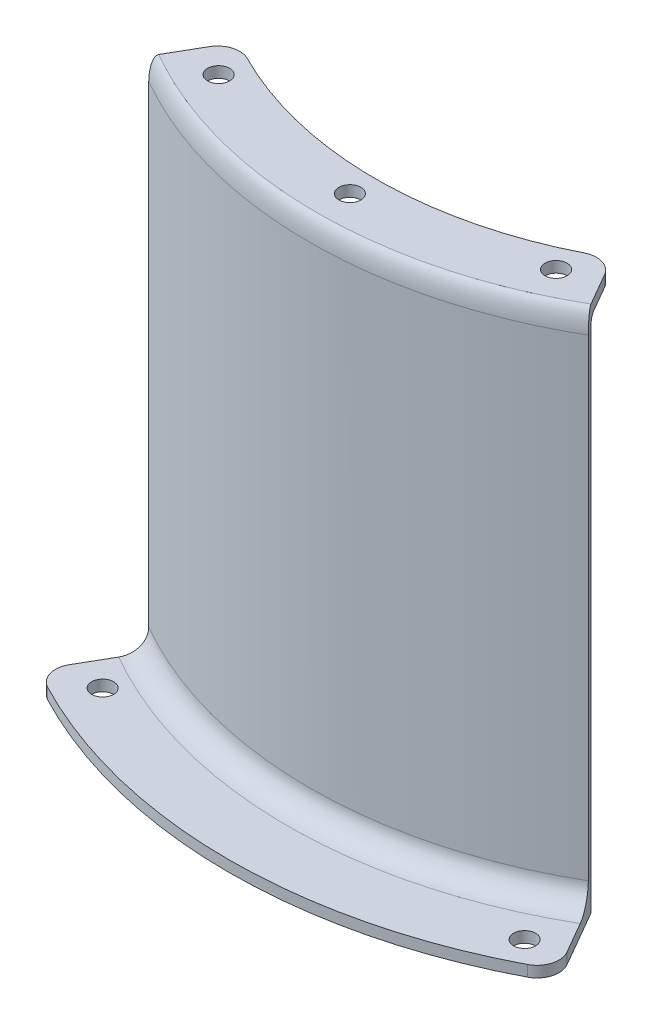
ISO-10303-21;
HEADER;
FILE_DESCRIPTION(('STEP AP214'),'2;1');
FILE_NAME('part.step','',(''),(''),'','','');
FILE_SCHEMA(('AUTOMOTIVE_DESIGN { 1 0 10303 214 1 1 1 1 }'));
ENDSEC;
DATA;
#1=APPLICATION_CONTEXT('core data for automotive mechanical design processes');
#2=APPLICATION_PROTOCOL_DEFINITION('international standard','automotive_design',2000,#1);
#3=PRODUCT_CONTEXT('',#1,'mechanical');
#4=PRODUCT('Part','Part','',(#3));
#5=PRODUCT_RELATED_PRODUCT_CATEGORY('part','',(#4));
#6=PRODUCT_DEFINITION_FORMATION('','',#4);
#7=PRODUCT_DEFINITION_CONTEXT('part definition',#1,'design');
#8=PRODUCT_DEFINITION('design','',#6,#7);
#9=PRODUCT_DEFINITION_SHAPE('','',#8);
#10=(LENGTH_UNIT() NAMED_UNIT(*) SI_UNIT(.MILLI.,.METRE.));
#11=(NAMED_UNIT(*) PLANE_ANGLE_UNIT() SI_UNIT($,.RADIAN.));
#12=(NAMED_UNIT(*) SI_UNIT($,.STERADIAN.) SOLID_ANGLE_UNIT());
#13=UNCERTAINTY_MEASURE_WITH_UNIT(LENGTH_MEASURE(1.E-05),#10,'distance_accuracy_value','');
#14=(GEOMETRIC_REPRESENTATION_CONTEXT(3) GLOBAL_UNCERTAINTY_ASSIGNED_CONTEXT((#13)) GLOBAL_UNIT_ASSIGNED_CONTEXT((#10,
#11,#12)) REPRESENTATION_CONTEXT('',''));
#15=CARTESIAN_POINT('',(0.,0.,0.));
#16=DIRECTION('',(0.,0.,1.));
#17=DIRECTION('',(1.,0.,0.));
#18=AXIS2_PLACEMENT_3D('',#15,#16,#17);
#19=CARTESIAN_POINT('',(23.0326952648682,-0.001000000000001,-9.6062256065026));
#20=DIRECTION('',(0.,1.,0.));
#21=DIRECTION('',(0.4226182617407,0.,0.90630778703665));
#22=AXIS2_PLACEMENT_3D('',#19,#20,#21);
#23=CYLINDRICAL_SURFACE('',#22,1.5);
#24=CARTESIAN_POINT('',(23.0326952648682,70.5,-9.6062256065026));
#25=DIRECTION('',(0.,-1.,0.));
#26=DIRECTION('',(-0.4226182617407,0.,-0.90630778703665));
#27=AXIS2_PLACEMENT_3D('',#24,#25,#26);
#28=CIRCLE('',#27,1.5);
#29=CARTESIAN_POINT('',(22.3987678722571,70.5,-10.9656872870576));
#30=VERTEX_POINT('',#29);
#31=EDGE_CURVE('E388',#30,#30,#28,.F.);
#32=ORIENTED_EDGE('',*,*,#31,.F.);
#33=EDGE_LOOP('',(#32));
#34=FACE_BOUND('',#33,.T.);
#35=CARTESIAN_POINT('',(23.0326952648682,72.,-9.6062256065026));
#36=DIRECTION('',(0.,1.,0.));
#37=DIRECTION('',(0.4226182617407,0.,0.90630778703665));
#38=AXIS2_PLACEMENT_3D('',#35,#36,#37);
#39=CIRCLE('',#38,1.5);
#40=CARTESIAN_POINT('',(23.6666226574792,72.,-8.24676392594762));
#41=VERTEX_POINT('',#40);
#42=EDGE_CURVE('E391',#41,#41,#39,.T.);
#43=ORIENTED_EDGE('',*,*,#42,.T.);
#44=EDGE_LOOP('',(#43));
#45=FACE_BOUND('',#44,.T.);
#46=ADVANCED_FACE('F45',(#34,#45),#23,.F.);
#47=CARTESIAN_POINT('',(-23.0326952648682,-0.001000000000001,-9.6062256065026));
#48=DIRECTION('',(0.,1.,0.));
#49=DIRECTION('',(-0.4226182617407,0.,0.90630778703665));
#50=AXIS2_PLACEMENT_3D('',#47,#48,#49);
#51=CYLINDRICAL_SURFACE('',#50,1.5);
#52=CARTESIAN_POINT('',(-23.0326952648682,70.5,-9.6062256065026));
#53=DIRECTION('',(0.,-1.,0.));
#54=DIRECTION('',(0.4226182617407,0.,-0.90630778703665));
#55=AXIS2_PLACEMENT_3D('',#52,#53,#54);
#56=CIRCLE('',#55,1.5);
#57=CARTESIAN_POINT('',(-22.3987678722571,70.5,-10.9656872870576));
#58=VERTEX_POINT('',#57);
#59=EDGE_CURVE('E170',#58,#58,#56,.F.);
#60=ORIENTED_EDGE('',*,*,#59,.F.);
#61=EDGE_LOOP('',(#60));
#62=FACE_BOUND('',#61,.T.);
#63=CARTESIAN_POINT('',(-23.0326952648682,72.,-9.6062256065026));
#64=DIRECTION('',(0.,1.,0.));
#65=DIRECTION('',(-0.4226182617407,0.,0.90630778703665));
#66=AXIS2_PLACEMENT_3D('',#63,#64,#65);
#67=CIRCLE('',#66,1.5);
#68=CARTESIAN_POINT('',(-23.6666226574792,72.,-8.24676392594762));
#69=VERTEX_POINT('',#68);
#70=EDGE_CURVE('E385',#69,#69,#67,.T.);
#71=ORIENTED_EDGE('',*,*,#70,.T.);
#72=EDGE_LOOP('',(#71));
#73=FACE_BOUND('',#72,.T.);
#74=ADVANCED_FACE('F411',(#62,#73),#51,.F.);
#75=CARTESIAN_POINT('',(0.,75.6,-59.));
#76=DIRECTION('',(0.,1.,0.));
#77=DIRECTION('',(0.,0.,1.));
#78=AXIS2_PLACEMENT_3D('',#75,#76,#77);
#79=CYLINDRICAL_SURFACE('',#78,59.);
#80=DIRECTION('',(0.,1.,0.));
#81=VECTOR('',#80,1.);
#82=CARTESIAN_POINT('',(-29.5000000000001,70.5,-7.90450117671816));
#83=LINE('',#82,#81);
#84=CARTESIAN_POINT('',(-29.5000000000001,0.,-7.90450117671816));
#85=VERTEX_POINT('',#84);
#86=CARTESIAN_POINT('',(-29.5000000000001,69.5,-7.90450117671816));
#87=VERTEX_POINT('',#86);
#88=EDGE_CURVE('E158',#85,#87,#83,.T.);
#89=ORIENTED_EDGE('',*,*,#88,.T.);
#90=CARTESIAN_POINT('',(0.,69.5,-59.));
#91=DIRECTION('',(0.,-1.,0.));
#92=DIRECTION('',(0.,0.,-1.));
#93=AXIS2_PLACEMENT_3D('',#90,#91,#92);
#94=CIRCLE('',#93,59.);
#95=CARTESIAN_POINT('',(29.5000000000001,69.5,-7.90450117671816));
#96=VERTEX_POINT('',#95);
#97=EDGE_CURVE('E176',#87,#96,#94,.F.);
#98=ORIENTED_EDGE('',*,*,#97,.T.);
#99=DIRECTION('',(0.,1.,0.));
#100=VECTOR('',#99,1.);
#101=CARTESIAN_POINT('',(29.5000000000001,70.5,-7.90450117671816));
#102=LINE('',#101,#100);
#103=CARTESIAN_POINT('',(29.5000000000001,0.,-7.90450117671816));
#104=VERTEX_POINT('',#103);
#105=EDGE_CURVE('E154',#104,#96,#102,.T.);
#106=ORIENTED_EDGE('',*,*,#105,.F.);
#107=CARTESIAN_POINT('',(0.,0.,-59.));
#108=DIRECTION('',(0.,1.,0.));
#109=DIRECTION('',(0.,0.,1.));
#110=AXIS2_PLACEMENT_3D('',#107,#108,#109);
#111=CIRCLE('',#110,59.);
#112=EDGE_CURVE('E162',#85,#104,#111,.T.);
#113=ORIENTED_EDGE('',*,*,#112,.F.);
#114=EDGE_LOOP('',(#89,#98,#106,#113));
#115=FACE_BOUND('',#114,.T.);
#116=ADVANCED_FACE('F174',(#115),#79,.F.);
#117=CARTESIAN_POINT('',(-29.5000000000001,0.,-7.90450117671816));
#118=DIRECTION('',(0.,-1.,0.));
#119=DIRECTION('',(0.,0.,-1.));
#120=AXIS2_PLACEMENT_3D('',#117,#118,#119);
#121=PLANE('',#120);
#122=CARTESIAN_POINT('',(-28.9324956880792,0.,0.320407055745003));
#123=DIRECTION('',(0.,-1.,0.));
#124=DIRECTION('',(0.,0.,-1.));
#125=AXIS2_PLACEMENT_3D('',#122,#123,#124);
#126=CIRCLE('',#125,1.5);
#127=CARTESIAN_POINT('',(-28.9324956880792,0.,-1.179592944255));
#128=VERTEX_POINT('',#127);
#129=EDGE_CURVE('E440',#128,#128,#126,.F.);
#130=ORIENTED_EDGE('',*,*,#129,.T.);
#131=EDGE_LOOP('',(#130));
#132=FACE_BOUND('',#131,.T.);
#133=CARTESIAN_POINT('',(29.5939208798571,0.,1.24752451077618));
#134=DIRECTION('',(0.,-1.,0.));
#135=DIRECTION('',(0.,0.,-1.));
#136=AXIS2_PLACEMENT_3D('',#133,#134,#135);
#137=CIRCLE('',#136,1.5);
#138=CARTESIAN_POINT('',(29.5939208798571,0.,-0.252475489223819));
#139=VERTEX_POINT('',#138);
#140=EDGE_CURVE('E445',#139,#139,#137,.F.);
#141=ORIENTED_EDGE('',*,*,#140,.T.);
#142=EDGE_LOOP('',(#141));
#143=FACE_BOUND('',#142,.T.);
#144=CARTESIAN_POINT('',(0.,0.,-59.));
#145=DIRECTION('',(0.,1.,0.));
#146=DIRECTION('',(0.,0.,1.));
#147=AXIS2_PLACEMENT_3D('',#144,#145,#146);
#148=CIRCLE('',#147,71.);
#149=CARTESIAN_POINT('',(-32.7527379417869,0.,3.99411208451655));
#150=VERTEX_POINT('',#149);
#151=CARTESIAN_POINT('',(32.7527379417869,0.,3.99411208451655));
#152=VERTEX_POINT('',#151);
#153=EDGE_CURVE('E171',#150,#152,#148,.T.);
#154=ORIENTED_EDGE('',*,*,#153,.F.);
#155=CARTESIAN_POINT('',(-31.3688194372043,0.,1.33238903869191));
#156=DIRECTION('',(0.,-1.,0.));
#157=DIRECTION('',(0.,0.,-1.));
#158=AXIS2_PLACEMENT_3D('',#155,#156,#157);
#159=CIRCLE('',#158,3.);
#160=CARTESIAN_POINT('',(-33.9668956485576,0.,-0.167610961308088));
#161=VERTEX_POINT('',#160);
#162=EDGE_CURVE('E356',#150,#161,#159,.T.);
#163=ORIENTED_EDGE('',*,*,#162,.T.);
#164=DIRECTION('',(0.500000000000001,0.,-0.866025403784438));
#165=VECTOR('',#164,1.);
#166=CARTESIAN_POINT('',(-29.5000000000001,0.,-7.90450117671816));
#167=LINE('',#166,#165);
#168=EDGE_CURVE('E166',#161,#85,#167,.T.);
#169=ORIENTED_EDGE('',*,*,#168,.T.);
#170=ORIENTED_EDGE('',*,*,#112,.T.);
#171=DIRECTION('',(-0.500000000000001,0.,-0.866025403784438));
#172=VECTOR('',#171,1.);
#173=CARTESIAN_POINT('',(29.5000000000001,0.,-7.90450117671816));
#174=LINE('',#173,#172);
#175=CARTESIAN_POINT('',(33.9668956485576,0.,-0.1676109613081));
#176=VERTEX_POINT('',#175);
#177=EDGE_CURVE('E150',#176,#104,#174,.T.);
#178=ORIENTED_EDGE('',*,*,#177,.F.);
#179=CARTESIAN_POINT('',(31.3688194372043,0.,1.3323890386919));
#180=DIRECTION('',(0.,-1.,0.));
#181=DIRECTION('',(0.,0.,-1.));
#182=AXIS2_PLACEMENT_3D('',#179,#180,#181);
#183=CIRCLE('',#182,3.);
#184=EDGE_CURVE('E354',#176,#152,#183,.T.);
#185=ORIENTED_EDGE('',*,*,#184,.T.);
#186=EDGE_LOOP('',(#154,#163,#169,#170,#178,#185));
#187=FACE_BOUND('',#186,.T.);
#188=ADVANCED_FACE('F164',(#132,#143,#187),#121,.T.);
#189=CARTESIAN_POINT('',(0.,75.6,-59.));
#190=DIRECTION('',(0.,1.,0.));
#191=DIRECTION('',(0.,0.,1.));
#192=AXIS2_PLACEMENT_3D('',#189,#190,#191);
#193=CYLINDRICAL_SURFACE('',#192,71.);
#194=CARTESIAN_POINT('',(0.,1.5,-59.));
#195=DIRECTION('',(0.,1.,0.));
#196=DIRECTION('',(0.,0.,1.));
#197=AXIS2_PLACEMENT_3D('',#194,#195,#196);
#198=CIRCLE('',#197,71.);
#199=CARTESIAN_POINT('',(-32.7527379417869,1.5,3.99411208451655));
#200=VERTEX_POINT('',#199);
#201=CARTESIAN_POINT('',(32.7527379417869,1.5,3.99411208451655));
#202=VERTEX_POINT('',#201);
#203=EDGE_CURVE('E378',#200,#202,#198,.T.);
#204=ORIENTED_EDGE('',*,*,#203,.F.);
#205=DIRECTION('',(0.,1.,0.));
#206=VECTOR('',#205,1.);
#207=CARTESIAN_POINT('',(-32.7527379417869,75.6,3.99411208451657));
#208=LINE('',#207,#206);
#209=EDGE_CURVE('E351',#200,#150,#208,.F.);
#210=ORIENTED_EDGE('',*,*,#209,.T.);
#211=ORIENTED_EDGE('',*,*,#153,.T.);
#212=DIRECTION('',(0.,1.,0.));
#213=VECTOR('',#212,1.);
#214=CARTESIAN_POINT('',(32.7527379417869,75.6,3.99411208451655));
#215=LINE('',#214,#213);
#216=EDGE_CURVE('E349',#152,#202,#215,.T.);
#217=ORIENTED_EDGE('',*,*,#216,.T.);
#218=EDGE_LOOP('',(#204,#210,#211,#217));
#219=FACE_BOUND('',#218,.T.);
#220=ADVANCED_FACE('F457',(#219),#193,.T.);
#221=CARTESIAN_POINT('',(-29.9999999999999,1.5,-7.03847577293393));
#222=DIRECTION('',(0.,1.,0.));
#223=DIRECTION('',(0.,0.,1.));
#224=AXIS2_PLACEMENT_3D('',#221,#222,#223);
#225=PLANE('',#224);
#226=CARTESIAN_POINT('',(-28.9324956880792,1.5,0.320407055745003));
#227=DIRECTION('',(0.,1.,0.));
#228=DIRECTION('',(0.,0.,1.));
#229=AXIS2_PLACEMENT_3D('',#226,#227,#228);
#230=CIRCLE('',#229,1.5);
#231=CARTESIAN_POINT('',(-28.9324956880792,1.5,1.820407055745));
#232=VERTEX_POINT('',#231);
#233=EDGE_CURVE('E438',#232,#232,#230,.T.);
#234=ORIENTED_EDGE('',*,*,#233,.F.);
#235=EDGE_LOOP('',(#234));
#236=FACE_BOUND('',#235,.T.);
#237=CARTESIAN_POINT('',(29.5939208798571,1.5,1.24752451077618));
#238=DIRECTION('',(0.,1.,0.));
#239=DIRECTION('',(0.,0.,1.));
#240=AXIS2_PLACEMENT_3D('',#237,#238,#239);
#241=CIRCLE('',#240,1.5);
#242=CARTESIAN_POINT('',(29.5939208798571,1.5,2.74752451077618));
#243=VERTEX_POINT('',#242);
#244=EDGE_CURVE('E450',#243,#243,#241,.T.);
#245=ORIENTED_EDGE('',*,*,#244,.F.);
#246=EDGE_LOOP('',(#245));
#247=FACE_BOUND('',#246,.T.);
#248=DIRECTION('',(0.500000000000001,0.,0.866025403784438));
#249=VECTOR('',#248,1.);
#250=CARTESIAN_POINT('',(29.9999999999999,1.5,-7.03847577293393));
#251=LINE('',#250,#249);
#252=CARTESIAN_POINT('',(31.5,1.5,-4.44039956158051));
#253=VERTEX_POINT('',#252);
#254=CARTESIAN_POINT('',(33.9668956485576,1.5,-0.167610961308099));
#255=VERTEX_POINT('',#254);
#256=EDGE_CURVE('E159',#253,#255,#251,.T.);
#257=ORIENTED_EDGE('',*,*,#256,.F.);
#258=CARTESIAN_POINT('',(0.,1.5,-59.));
#259=DIRECTION('',(0.,1.,0.));
#260=DIRECTION('',(0.,0.,1.));
#261=AXIS2_PLACEMENT_3D('',#258,#259,#260);
#262=CIRCLE('',#261,62.9999999999999);
#263=CARTESIAN_POINT('',(-31.5,1.5,-4.4403995615805));
#264=VERTEX_POINT('',#263);
#265=EDGE_CURVE('E66',#253,#264,#262,.F.);
#266=ORIENTED_EDGE('',*,*,#265,.T.);
#267=DIRECTION('',(-0.500000000000001,0.,0.866025403784438));
#268=VECTOR('',#267,1.);
#269=CARTESIAN_POINT('',(-29.9999999999999,1.5,-7.03847577293393));
#270=LINE('',#269,#268);
#271=CARTESIAN_POINT('',(-33.9668956485576,1.5,-0.167610961308089));
#272=VERTEX_POINT('',#271);
#273=EDGE_CURVE('E369',#264,#272,#270,.T.);
#274=ORIENTED_EDGE('',*,*,#273,.T.);
#275=CARTESIAN_POINT('',(-31.3688194372043,1.5,1.33238903869191));
#276=DIRECTION('',(0.,1.,0.));
#277=DIRECTION('',(0.,0.,1.));
#278=AXIS2_PLACEMENT_3D('',#275,#276,#277);
#279=CIRCLE('',#278,3.);
#280=EDGE_CURVE('E196',#272,#200,#279,.T.);
#281=ORIENTED_EDGE('',*,*,#280,.T.);
#282=ORIENTED_EDGE('',*,*,#203,.T.);
#283=CARTESIAN_POINT('',(31.3688194372043,1.5,1.3323890386919));
#284=DIRECTION('',(0.,1.,0.));
#285=DIRECTION('',(0.,0.,1.));
#286=AXIS2_PLACEMENT_3D('',#283,#284,#285);
#287=CIRCLE('',#286,3.);
#288=EDGE_CURVE('E462',#202,#255,#287,.T.);
#289=ORIENTED_EDGE('',*,*,#288,.T.);
#290=EDGE_LOOP('',(#257,#266,#274,#281,#282,#289));
#291=FACE_BOUND('',#290,.T.);
#292=ADVANCED_FACE('F455',(#236,#247,#291),#225,.T.);
#293=CARTESIAN_POINT('',(0.,75.6,-59.));
#294=DIRECTION('',(0.,1.,0.));
#295=DIRECTION('',(0.,0.,1.));
#296=AXIS2_PLACEMENT_3D('',#293,#294,#295);
#297=CYLINDRICAL_SURFACE('',#296,59.9999999999999);
#298=DIRECTION('',(0.,-1.,0.));
#299=VECTOR('',#298,1.);
#300=CARTESIAN_POINT('',(-30.0000000000001,72.,-7.03847577293372));
#301=LINE('',#300,#299);
#302=CARTESIAN_POINT('',(-29.9999067155062,69.,-7.03863734641666));
#303=VERTEX_POINT('',#302);
#304=CARTESIAN_POINT('',(-29.9999999999999,4.5,-7.03847577293392));
#305=VERTEX_POINT('',#304);
#306=EDGE_CURVE('E225',#303,#305,#301,.T.);
#307=ORIENTED_EDGE('',*,*,#306,.T.);
#308=CARTESIAN_POINT('',(0.,4.5,-59.));
#309=DIRECTION('',(0.,1.,0.));
#310=DIRECTION('',(0.,0.,1.));
#311=AXIS2_PLACEMENT_3D('',#308,#309,#310);
#312=CIRCLE('',#311,59.9999999999999);
#313=CARTESIAN_POINT('',(29.9999999999999,4.5,-7.03847577293392));
#314=VERTEX_POINT('',#313);
#315=EDGE_CURVE('E215',#305,#314,#312,.T.);
#316=ORIENTED_EDGE('',*,*,#315,.T.);
#317=DIRECTION('',(0.,-1.,0.));
#318=VECTOR('',#317,1.);
#319=CARTESIAN_POINT('',(30.0000000000001,72.,-7.03847577293372));
#320=LINE('',#319,#318);
#321=CARTESIAN_POINT('',(29.9999067454248,69.,-7.03863736368315));
#322=VERTEX_POINT('',#321);
#323=EDGE_CURVE('E195',#322,#314,#320,.T.);
#324=ORIENTED_EDGE('',*,*,#323,.F.);
#325=CARTESIAN_POINT('',(-32.6783421009016,69.,-8.67976592327472));
#326=CARTESIAN_POINT('',(-27.8476934877415,69.,-5.54270603381946));
#327=CARTESIAN_POINT('',(-22.5633259131442,69.,-3.10662686195295));
#328=CARTESIAN_POINT('',(-11.5185154513269,69.,0.164995046135756));
#329=CARTESIAN_POINT('',(-5.75958653134703,69.,0.999999999999885));
#330=CARTESIAN_POINT('',(5.75958653134725,69.,0.999999999999865));
#331=CARTESIAN_POINT('',(11.5185154513446,69.,0.164995046130466));
#332=CARTESIAN_POINT('',(22.5633259131258,69.,-3.10662686194748));
#333=CARTESIAN_POINT('',(27.847693487753,69.,-5.54270603382691));
#334=CARTESIAN_POINT('',(32.6783421009018,69.,-8.67976592327483));
#335=(BOUNDED_CURVE() B_SPLINE_CURVE(3,(#325,#326,#327,#328,#329,#330,#331,#332,#333,#334),
.UNSPECIFIED.,.F.,.F.) B_SPLINE_CURVE_WITH_KNOTS((4,2,2,2,4),(5.70722665402146,5.99520598060052,
6.28318530717959,6.57116463375865,6.85914396033772),
.UNSPECIFIED.) CURVE() GEOMETRIC_REPRESENTATION_ITEM() RATIONAL_B_SPLINE_CURVE((1.,1.,1.,1.,1.,
1.,1.,1.,1.,1.)) REPRESENTATION_ITEM(''));
#336=EDGE_CURVE('E400',#322,#303,#335,.F.);
#337=ORIENTED_EDGE('',*,*,#336,.T.);
#338=EDGE_LOOP('',(#307,#316,#324,#337));
#339=FACE_BOUND('',#338,.T.);
#340=ADVANCED_FACE('F222',(#339),#297,.T.);
#341=CARTESIAN_POINT('',(-25.5,72.,-14.8327044069937));
#342=DIRECTION('',(0.,1.,0.));
#343=DIRECTION('',(0.,0.,1.));
#344=AXIS2_PLACEMENT_3D('',#341,#342,#343);
#345=PLANE('',#344);
#346=ORIENTED_EDGE('',*,*,#42,.F.);
#347=EDGE_LOOP('',(#346));
#348=FACE_BOUND('',#347,.T.);
#349=ORIENTED_EDGE('',*,*,#70,.F.);
#350=EDGE_LOOP('',(#349));
#351=FACE_BOUND('',#350,.T.);
#352=CARTESIAN_POINT('',(0.,72.,-4.5));
#353=DIRECTION('',(0.,1.,0.));
#354=DIRECTION('',(0.,0.,1.));
#355=AXIS2_PLACEMENT_3D('',#352,#353,#354);
#356=CIRCLE('',#355,1.5);
#357=CARTESIAN_POINT('',(0.,72.,-3.));
#358=VERTEX_POINT('',#357);
#359=EDGE_CURVE('E178',#358,#358,#356,.T.);
#360=ORIENTED_EDGE('',*,*,#359,.F.);
#361=EDGE_LOOP('',(#360));
#362=FACE_BOUND('',#361,.T.);
#363=CARTESIAN_POINT('',(0.,72.,-59.));
#364=DIRECTION('',(0.,1.,0.));
#365=DIRECTION('',(0.,0.,1.));
#366=AXIS2_PLACEMENT_3D('',#363,#364,#365);
#367=CIRCLE('',#366,51.);
#368=CARTESIAN_POINT('',(-23.0068790930603,72.,-13.4842498205588));
#369=VERTEX_POINT('',#368);
#370=CARTESIAN_POINT('',(23.0068790930603,72.,-13.4842498205588));
#371=VERTEX_POINT('',#370);
#372=EDGE_CURVE('E375',#369,#371,#367,.T.);
#373=ORIENTED_EDGE('',*,*,#372,.F.);
#374=CARTESIAN_POINT('',(-24.3602249220639,72.,-10.8068527511799));
#375=DIRECTION('',(0.,1.,0.));
#376=DIRECTION('',(0.,0.,1.));
#377=AXIS2_PLACEMENT_3D('',#374,#375,#376);
#378=CIRCLE('',#377,3.);
#379=CARTESIAN_POINT('',(-26.9583011334172,72.,-12.3068527511799));
#380=VERTEX_POINT('',#379);
#381=EDGE_CURVE('E209',#369,#380,#378,.T.);
#382=ORIENTED_EDGE('',*,*,#381,.T.);
#383=DIRECTION('',(-0.500000000000001,0.,0.866025403784438));
#384=VECTOR('',#383,1.);
#385=CARTESIAN_POINT('',(-25.5,72.,-14.8327044069937));
#386=LINE('',#385,#384);
#387=CARTESIAN_POINT('',(-29.4998165404898,72.,-7.90481893791096));
#388=VERTEX_POINT('',#387);
#389=EDGE_CURVE('E359',#380,#388,#386,.T.);
#390=ORIENTED_EDGE('',*,*,#389,.T.);
#391=CARTESIAN_POINT('',(32.1337030658868,72.,-9.51843649122025));
#392=CARTESIAN_POINT('',(27.3835652629588,72.,-6.43366093326307));
#393=CARTESIAN_POINT('',(22.1872704812371,72.,-4.03818308091657));
#394=CARTESIAN_POINT('',(11.3265401938255,72.,-0.82108820463683));
#395=CARTESIAN_POINT('',(5.66359342249146,72.,-1.2490009027033E-13));
#396=CARTESIAN_POINT('',(-5.66359342249125,72.,-1.2490009027033E-13));
#397=CARTESIAN_POINT('',(-11.3265401938061,72.,-0.82108820463692));
#398=CARTESIAN_POINT('',(-22.1872704812571,72.,-4.03818308091666));
#399=CARTESIAN_POINT('',(-27.3835652629309,72.,-6.43366093328321));
#400=CARTESIAN_POINT('',(-32.1337030658866,72.,-9.51843649122015));
#401=(BOUNDED_CURVE() B_SPLINE_CURVE(3,(#391,#392,#393,#394,#395,#396,#397,#398,#399,#400),
.UNSPECIFIED.,.F.,.F.) B_SPLINE_CURVE_WITH_KNOTS((4,2,2,2,4),(5.70722665402146,5.99520598060052,
6.28318530717959,6.57116463375865,6.85914396033772),
.UNSPECIFIED.) CURVE() GEOMETRIC_REPRESENTATION_ITEM() RATIONAL_B_SPLINE_CURVE((1.,1.,1.,1.,1.,
1.,1.,1.,1.,1.)) REPRESENTATION_ITEM(''));
#402=CARTESIAN_POINT('',(29.4998165404952,72.,-7.90481893790173));
#403=VERTEX_POINT('',#402);
#404=EDGE_CURVE('E393',#388,#403,#401,.F.);
#405=ORIENTED_EDGE('',*,*,#404,.T.);
#406=DIRECTION('',(0.500000000000001,0.,0.866025403784438));
#407=VECTOR('',#406,1.);
#408=CARTESIAN_POINT('',(25.5,72.,-14.8327044069937));
#409=LINE('',#408,#407);
#410=CARTESIAN_POINT('',(26.9583011334172,72.,-12.3068527511799));
#411=VERTEX_POINT('',#410);
#412=EDGE_CURVE('E181',#411,#403,#409,.T.);
#413=ORIENTED_EDGE('',*,*,#412,.F.);
#414=CARTESIAN_POINT('',(24.3602249220639,72.,-10.8068527511799));
#415=DIRECTION('',(0.,1.,0.));
#416=DIRECTION('',(0.,0.,1.));
#417=AXIS2_PLACEMENT_3D('',#414,#415,#416);
#418=CIRCLE('',#417,3.);
#419=EDGE_CURVE('E207',#411,#371,#418,.T.);
#420=ORIENTED_EDGE('',*,*,#419,.T.);
#421=EDGE_LOOP('',(#373,#382,#390,#405,#413,#420));
#422=FACE_BOUND('',#421,.T.);
#423=ADVANCED_FACE('F397',(#348,#351,#362,#422),#345,.T.);
#424=CARTESIAN_POINT('',(0.,75.6,-59.));
#425=DIRECTION('',(0.,1.,0.));
#426=DIRECTION('',(0.,0.,1.));
#427=AXIS2_PLACEMENT_3D('',#424,#425,#426);
#428=CYLINDRICAL_SURFACE('',#427,51.);
#429=CARTESIAN_POINT('',(0.,70.5,-59.));
#430=DIRECTION('',(0.,1.,0.));
#431=DIRECTION('',(0.,0.,1.));
#432=AXIS2_PLACEMENT_3D('',#429,#430,#431);
#433=CIRCLE('',#432,51.);
#434=CARTESIAN_POINT('',(-23.0068790930603,70.5,-13.4842498205588));
#435=VERTEX_POINT('',#434);
#436=CARTESIAN_POINT('',(23.0068790930603,70.5,-13.4842498205588));
#437=VERTEX_POINT('',#436);
#438=EDGE_CURVE('E372',#435,#437,#433,.T.);
#439=ORIENTED_EDGE('',*,*,#438,.F.);
#440=DIRECTION('',(0.,1.,0.));
#441=VECTOR('',#440,1.);
#442=CARTESIAN_POINT('',(-23.0068790930603,75.6,-13.4842498205588));
#443=LINE('',#442,#441);
#444=EDGE_CURVE('E204',#435,#369,#443,.T.);
#445=ORIENTED_EDGE('',*,*,#444,.T.);
#446=ORIENTED_EDGE('',*,*,#372,.T.);
#447=DIRECTION('',(0.,1.,0.));
#448=VECTOR('',#447,1.);
#449=CARTESIAN_POINT('',(23.0068790930603,75.6,-13.4842498205588));
#450=LINE('',#449,#448);
#451=EDGE_CURVE('E202',#371,#437,#450,.F.);
#452=ORIENTED_EDGE('',*,*,#451,.T.);
#453=EDGE_LOOP('',(#439,#445,#446,#452));
#454=FACE_BOUND('',#453,.T.);
#455=ADVANCED_FACE('F424',(#454),#428,.F.);
#456=CARTESIAN_POINT('',(-27.2500000000001,70.5,-11.8016154937481));
#457=DIRECTION('',(0.,-1.,0.));
#458=DIRECTION('',(0.,0.,-1.));
#459=AXIS2_PLACEMENT_3D('',#456,#457,#458);
#460=PLANE('',#459);
#461=ORIENTED_EDGE('',*,*,#31,.T.);
#462=EDGE_LOOP('',(#461));
#463=FACE_BOUND('',#462,.T.);
#464=ORIENTED_EDGE('',*,*,#59,.T.);
#465=EDGE_LOOP('',(#464));
#466=FACE_BOUND('',#465,.T.);
#467=CARTESIAN_POINT('',(0.,70.5,-4.5));
#468=DIRECTION('',(0.,-1.,0.));
#469=DIRECTION('',(0.,0.,-1.));
#470=AXIS2_PLACEMENT_3D('',#467,#468,#469);
#471=CIRCLE('',#470,1.5);
#472=CARTESIAN_POINT('',(0.,70.5,-6.));
#473=VERTEX_POINT('',#472);
#474=EDGE_CURVE('E184',#473,#473,#471,.F.);
#475=ORIENTED_EDGE('',*,*,#474,.T.);
#476=EDGE_LOOP('',(#475));
#477=FACE_BOUND('',#476,.T.);
#478=DIRECTION('',(0.500000000000001,0.,-0.866025403784438));
#479=VECTOR('',#478,1.);
#480=CARTESIAN_POINT('',(-27.2500000000001,70.5,-11.8016154937481));
#481=LINE('',#480,#479);
#482=CARTESIAN_POINT('',(-29.0000000000001,70.5,-8.7705265805026));
#483=VERTEX_POINT('',#482);
#484=CARTESIAN_POINT('',(-26.9583011334172,70.5,-12.3068527511799));
#485=VERTEX_POINT('',#484);
#486=EDGE_CURVE('E362',#483,#485,#481,.T.);
#487=ORIENTED_EDGE('',*,*,#486,.T.);
#488=CARTESIAN_POINT('',(-24.3602249220639,70.5,-10.8068527511799));
#489=DIRECTION('',(0.,-1.,0.));
#490=DIRECTION('',(0.,0.,-1.));
#491=AXIS2_PLACEMENT_3D('',#488,#489,#490);
#492=CIRCLE('',#491,3.);
#493=EDGE_CURVE('E213',#485,#435,#492,.T.);
#494=ORIENTED_EDGE('',*,*,#493,.T.);
#495=ORIENTED_EDGE('',*,*,#438,.T.);
#496=CARTESIAN_POINT('',(24.3602249220639,70.5,-10.8068527511799));
#497=DIRECTION('',(0.,-1.,0.));
#498=DIRECTION('',(0.,0.,-1.));
#499=AXIS2_PLACEMENT_3D('',#496,#497,#498);
#500=CIRCLE('',#499,3.);
#501=CARTESIAN_POINT('',(26.9583011334172,70.5,-12.3068527511799));
#502=VERTEX_POINT('',#501);
#503=EDGE_CURVE('E211',#437,#502,#500,.T.);
#504=ORIENTED_EDGE('',*,*,#503,.T.);
#505=DIRECTION('',(-0.500000000000001,0.,-0.866025403784438));
#506=VECTOR('',#505,1.);
#507=CARTESIAN_POINT('',(27.2500000000001,70.5,-11.8016154937481));
#508=LINE('',#507,#506);
#509=CARTESIAN_POINT('',(29.0000000000001,70.5,-8.7705265805026));
#510=VERTEX_POINT('',#509);
#511=EDGE_CURVE('E177',#510,#502,#508,.T.);
#512=ORIENTED_EDGE('',*,*,#511,.F.);
#513=CARTESIAN_POINT('',(0.,70.5,-59.));
#514=DIRECTION('',(0.,-1.,0.));
#515=DIRECTION('',(0.,0.,-1.));
#516=AXIS2_PLACEMENT_3D('',#513,#514,#515);
#517=CIRCLE('',#516,58.);
#518=EDGE_CURVE('E342',#510,#483,#517,.T.);
#519=ORIENTED_EDGE('',*,*,#518,.T.);
#520=EDGE_LOOP('',(#487,#494,#495,#504,#512,#519));
#521=FACE_BOUND('',#520,.T.);
#522=ADVANCED_FACE('F259',(#463,#466,#477,#521),#460,.T.);
#523=CARTESIAN_POINT('',(-29.5000000000001,0.,-7.90450117671816));
#524=DIRECTION('',(-0.866025403784438,0.,-0.500000000000001));
#525=DIRECTION('',(-0.500000000000001,0.,0.866025403784438));
#526=AXIS2_PLACEMENT_3D('',#523,#524,#525);
#527=PLANE('',#526);
#528=ORIENTED_EDGE('',*,*,#168,.F.);
#529=DIRECTION('',(0.,1.,0.));
#530=VECTOR('',#529,1.);
#531=CARTESIAN_POINT('',(-33.9668956485576,0.,-0.167610961308088));
#532=LINE('',#531,#530);
#533=EDGE_CURVE('E466',#161,#272,#532,.T.);
#534=ORIENTED_EDGE('',*,*,#533,.T.);
#535=ORIENTED_EDGE('',*,*,#273,.F.);
#536=CARTESIAN_POINT('',(-31.5,4.5,-4.4403995615805));
#537=DIRECTION('',(-0.866025403784438,0.,-0.500000000000001));
#538=DIRECTION('',(-0.500000000000001,0.,0.866025403784438));
#539=AXIS2_PLACEMENT_3D('',#536,#537,#538);
#540=CIRCLE('',#539,3.);
#541=EDGE_CURVE('E12',#264,#305,#540,.F.);
#542=ORIENTED_EDGE('',*,*,#541,.T.);
#543=ORIENTED_EDGE('',*,*,#306,.F.);
#544=CARTESIAN_POINT('',(-29.4998165404899,72.,-7.90481893791097));
#545=CARTESIAN_POINT('',(-29.9998134310089,72.,-7.03879891990519));
#546=CARTESIAN_POINT('',(-29.9998134310123,69.,-7.0387989198996));
#547=(BOUNDED_CURVE() B_SPLINE_CURVE(2,(#544,#545,#546),.UNSPECIFIED.,.F.,
.F.) B_SPLINE_CURVE_WITH_KNOTS((3,3),(0.,1.),
.UNSPECIFIED.) CURVE() GEOMETRIC_REPRESENTATION_ITEM() RATIONAL_B_SPLINE_CURVE((1.,
0.707106781186548,1.)) REPRESENTATION_ITEM(''));
#548=EDGE_CURVE('E343',#303,#388,#547,.F.);
#549=ORIENTED_EDGE('',*,*,#548,.T.);
#550=ORIENTED_EDGE('',*,*,#389,.F.);
#551=DIRECTION('',(0.,1.,0.));
#552=VECTOR('',#551,1.);
#553=CARTESIAN_POINT('',(-26.9583011334172,0.,-12.3068527511799));
#554=LINE('',#553,#552);
#555=EDGE_CURVE('E358',#380,#485,#554,.F.);
#556=ORIENTED_EDGE('',*,*,#555,.T.);
#557=ORIENTED_EDGE('',*,*,#486,.F.);
#558=CARTESIAN_POINT('',(-29.,69.5,-8.77052658050259));
#559=DIRECTION('',(-0.866025403784438,0.,-0.500000000000001));
#560=DIRECTION('',(-0.500000000000001,0.,0.866025403784438));
#561=AXIS2_PLACEMENT_3D('',#558,#559,#560);
#562=CIRCLE('',#561,1.);
#563=EDGE_CURVE('E347',#483,#87,#562,.F.);
#564=ORIENTED_EDGE('',*,*,#563,.T.);
#565=ORIENTED_EDGE('',*,*,#88,.F.);
#566=EDGE_LOOP('',(#528,#534,#535,#542,#543,#549,#550,#556,#557,#564,#565));
#567=FACE_BOUND('',#566,.T.);
#568=ADVANCED_FACE('F254',(#567),#527,.T.);
#569=CARTESIAN_POINT('',(29.5000000000001,0.,-7.90450117671816));
#570=DIRECTION('',(-0.866025403784438,0.,0.500000000000001));
#571=DIRECTION('',(0.500000000000001,0.,0.866025403784438));
#572=AXIS2_PLACEMENT_3D('',#569,#570,#571);
#573=PLANE('',#572);
#574=ORIENTED_EDGE('',*,*,#323,.T.);
#575=CARTESIAN_POINT('',(31.5,4.5,-4.44039956158051));
#576=DIRECTION('',(-0.866025403784438,0.,0.500000000000001));
#577=DIRECTION('',(0.500000000000001,0.,0.866025403784438));
#578=AXIS2_PLACEMENT_3D('',#575,#576,#577);
#579=CIRCLE('',#578,3.);
#580=EDGE_CURVE('E53',#314,#253,#579,.T.);
#581=ORIENTED_EDGE('',*,*,#580,.T.);
#582=ORIENTED_EDGE('',*,*,#256,.T.);
#583=DIRECTION('',(0.,-1.,0.));
#584=VECTOR('',#583,1.);
#585=CARTESIAN_POINT('',(33.9668956485576,0.,-0.1676109613081));
#586=LINE('',#585,#584);
#587=EDGE_CURVE('E156',#255,#176,#586,.T.);
#588=ORIENTED_EDGE('',*,*,#587,.T.);
#589=ORIENTED_EDGE('',*,*,#177,.T.);
#590=ORIENTED_EDGE('',*,*,#105,.T.);
#591=CARTESIAN_POINT('',(29.0000000000001,69.5,-8.7705265805026));
#592=DIRECTION('',(-0.866025403784438,0.,0.500000000000001));
#593=DIRECTION('',(0.500000000000001,0.,0.866025403784438));
#594=AXIS2_PLACEMENT_3D('',#591,#592,#593);
#595=CIRCLE('',#594,1.);
#596=EDGE_CURVE('E345',#96,#510,#595,.T.);
#597=ORIENTED_EDGE('',*,*,#596,.T.);
#598=ORIENTED_EDGE('',*,*,#511,.T.);
#599=DIRECTION('',(0.,-1.,0.));
#600=VECTOR('',#599,1.);
#601=CARTESIAN_POINT('',(26.9583011334172,72.,-12.3068527511799));
#602=LINE('',#601,#600);
#603=EDGE_CURVE('E198',#502,#411,#602,.F.);
#604=ORIENTED_EDGE('',*,*,#603,.T.);
#605=ORIENTED_EDGE('',*,*,#412,.T.);
#606=CARTESIAN_POINT('',(29.9998134310119,69.,-7.03879891990009));
#607=CARTESIAN_POINT('',(29.999813431008,72.,-7.03879891990589));
#608=CARTESIAN_POINT('',(29.4998165404954,72.,-7.90481893790186));
#609=(BOUNDED_CURVE() B_SPLINE_CURVE(2,(#606,#607,#608),.UNSPECIFIED.,.F.,
.F.) B_SPLINE_CURVE_WITH_KNOTS((3,3),(0.,1.),
.UNSPECIFIED.) CURVE() GEOMETRIC_REPRESENTATION_ITEM() RATIONAL_B_SPLINE_CURVE((1.,
0.707106781186548,1.)) REPRESENTATION_ITEM(''));
#610=EDGE_CURVE('E229',#403,#322,#609,.F.);
#611=ORIENTED_EDGE('',*,*,#610,.T.);
#612=EDGE_LOOP('',(#574,#581,#582,#588,#589,#590,#597,#598,#604,#605,#611));
#613=FACE_BOUND('',#612,.T.);
#614=ADVANCED_FACE('F152',(#613),#573,.F.);
#615=CARTESIAN_POINT('',(0.,-0.001000000000001,-4.5));
#616=DIRECTION('',(0.,1.,0.));
#617=DIRECTION('',(0.,0.,1.));
#618=AXIS2_PLACEMENT_3D('',#615,#616,#617);
#619=CYLINDRICAL_SURFACE('',#618,1.5);
#620=ORIENTED_EDGE('',*,*,#474,.F.);
#621=EDGE_LOOP('',(#620));
#622=FACE_BOUND('',#621,.T.);
#623=ORIENTED_EDGE('',*,*,#359,.T.);
#624=EDGE_LOOP('',(#623));
#625=FACE_BOUND('',#624,.T.);
#626=ADVANCED_FACE('F253',(#622,#625),#619,.F.);
#627=CARTESIAN_POINT('',(29.5939208798571,-0.000999999999999916,1.24752451077618));
#628=DIRECTION('',(0.,1.,0.));
#629=DIRECTION('',(0.,0.,1.));
#630=AXIS2_PLACEMENT_3D('',#627,#628,#629);
#631=CYLINDRICAL_SURFACE('',#630,1.5);
#632=ORIENTED_EDGE('',*,*,#140,.F.);
#633=EDGE_LOOP('',(#632));
#634=FACE_BOUND('',#633,.T.);
#635=ORIENTED_EDGE('',*,*,#244,.T.);
#636=EDGE_LOOP('',(#635));
#637=FACE_BOUND('',#636,.T.);
#638=ADVANCED_FACE('F429',(#634,#637),#631,.F.);
#639=CARTESIAN_POINT('',(-28.9324956880792,-0.000999999999999916,0.320407055745003));
#640=DIRECTION('',(0.,1.,0.));
#641=DIRECTION('',(0.,0.,1.));
#642=AXIS2_PLACEMENT_3D('',#639,#640,#641);
#643=CYLINDRICAL_SURFACE('',#642,1.5);
#644=ORIENTED_EDGE('',*,*,#129,.F.);
#645=EDGE_LOOP('',(#644));
#646=FACE_BOUND('',#645,.T.);
#647=ORIENTED_EDGE('',*,*,#233,.T.);
#648=EDGE_LOOP('',(#647));
#649=FACE_BOUND('',#648,.T.);
#650=ADVANCED_FACE('F298',(#646,#649),#643,.F.);
#651=CARTESIAN_POINT('',(-32.1337030658866,72.,-9.51843649122015));
#652=CARTESIAN_POINT('',(-27.3835652629309,72.,-6.43366093328321));
#653=CARTESIAN_POINT('',(-22.1872704812571,72.,-4.03818308091666));
#654=CARTESIAN_POINT('',(-11.3265401938061,72.,-0.82108820463692));
#655=CARTESIAN_POINT('',(-5.66359342249125,72.,-1.2490009027033E-13));
#656=CARTESIAN_POINT('',(5.66359342249146,72.,-1.2490009027033E-13));
#657=CARTESIAN_POINT('',(11.3265401938255,72.,-0.82108820463683));
#658=CARTESIAN_POINT('',(22.1872704812371,72.,-4.03818308091657));
#659=CARTESIAN_POINT('',(27.3835652629588,72.,-6.43366093326307));
#660=CARTESIAN_POINT('',(32.1337030658868,72.,-9.51843649122025));
#661=CARTESIAN_POINT('',(-32.6783421009016,72.,-8.67976592327472));
#662=CARTESIAN_POINT('',(-27.8476934877319,72.,-5.54270603383559));
#663=CARTESIAN_POINT('',(-22.5633259131453,72.,-3.10662686194935));
#664=CARTESIAN_POINT('',(-11.5185154513258,72.,0.164995046132156));
#665=CARTESIAN_POINT('',(-5.75958653134704,72.,0.999999999999875));
#666=CARTESIAN_POINT('',(5.75958653134725,72.,0.999999999999875));
#667=CARTESIAN_POINT('',(11.5185154513451,72.,0.164995046132247));
#668=CARTESIAN_POINT('',(22.5633259131253,72.,-3.10662686194926));
#669=CARTESIAN_POINT('',(27.8476934877424,72.,-5.5427060338424));
#670=CARTESIAN_POINT('',(32.6783421009018,72.,-8.67976592327483));
#671=CARTESIAN_POINT('',(-32.6783421009016,69.,-8.67976592327472));
#672=CARTESIAN_POINT('',(-27.8476934877415,69.,-5.54270603381946));
#673=CARTESIAN_POINT('',(-22.5633259131442,69.,-3.10662686195295));
#674=CARTESIAN_POINT('',(-11.5185154513269,69.,0.164995046135756));
#675=CARTESIAN_POINT('',(-5.75958653134703,69.,0.999999999999885));
#676=CARTESIAN_POINT('',(5.75958653134725,69.,0.999999999999865));
#677=CARTESIAN_POINT('',(11.5185154513446,69.,0.164995046130466));
#678=CARTESIAN_POINT('',(22.5633259131258,69.,-3.10662686194748));
#679=CARTESIAN_POINT('',(27.847693487753,69.,-5.54270603382691));
#680=CARTESIAN_POINT('',(32.6783421009018,69.,-8.67976592327483));
#681=(BOUNDED_SURFACE() B_SPLINE_SURFACE(2,3,((#651,#652,#653,#654,#655,#656,#657,#658,#659,
#660),(#661,#662,#663,#664,#665,#666,#667,#668,#669,#670),(#671,#672,#673,#674,#675,#676,#677,
#678,#679,#680)),.UNSPECIFIED.,.F.,.F.,.F.) B_SPLINE_SURFACE_WITH_KNOTS((3,3),(4,2,2,2,4),(0.,
1.),(5.70722665402146,5.99520598060052,6.28318530717959,6.57116463375865,6.85914396033772),
.UNSPECIFIED.) GEOMETRIC_REPRESENTATION_ITEM() RATIONAL_B_SPLINE_SURFACE(((1.,1.,1.,1.,1.,1.,1.,
1.,1.,1.),(0.707106781186548,0.707106781186548,0.707106781186548,0.707106781186548,
0.707106781186548,0.707106781186548,0.707106781186548,0.707106781186548,0.707106781186548,
0.707106781186548),(1.,1.,1.,1.,1.,1.,1.,1.,1.,1.))) REPRESENTATION_ITEM('') SURFACE());
#682=ORIENTED_EDGE('',*,*,#548,.F.);
#683=ORIENTED_EDGE('',*,*,#336,.F.);
#684=ORIENTED_EDGE('',*,*,#610,.F.);
#685=ORIENTED_EDGE('',*,*,#404,.F.);
#686=EDGE_LOOP('',(#682,#683,#684,#685));
#687=FACE_BOUND('',#686,.T.);
#688=ADVANCED_FACE('F283',(#687),#681,.T.);
#689=CARTESIAN_POINT('',(0.,69.5,-59.));
#690=DIRECTION('',(0.,-1.,0.));
#691=DIRECTION('',(0.,0.,-1.));
#692=AXIS2_PLACEMENT_3D('',#689,#690,#691);
#693=TOROIDAL_SURFACE('',#692,58.,1.);
#694=ORIENTED_EDGE('',*,*,#563,.F.);
#695=ORIENTED_EDGE('',*,*,#518,.F.);
#696=ORIENTED_EDGE('',*,*,#596,.F.);
#697=ORIENTED_EDGE('',*,*,#97,.F.);
#698=EDGE_LOOP('',(#694,#695,#696,#697));
#699=FACE_BOUND('',#698,.T.);
#700=ADVANCED_FACE('F297',(#699),#693,.F.);
#701=CARTESIAN_POINT('',(-31.3688194372043,75.6,1.33238903869191));
#702=DIRECTION('',(0.,1.,0.));
#703=DIRECTION('',(0.,0.,1.));
#704=AXIS2_PLACEMENT_3D('',#701,#702,#703);
#705=CYLINDRICAL_SURFACE('',#704,3.);
#706=ORIENTED_EDGE('',*,*,#280,.F.);
#707=ORIENTED_EDGE('',*,*,#533,.F.);
#708=ORIENTED_EDGE('',*,*,#162,.F.);
#709=ORIENTED_EDGE('',*,*,#209,.F.);
#710=EDGE_LOOP('',(#706,#707,#708,#709));
#711=FACE_BOUND('',#710,.T.);
#712=ADVANCED_FACE('F472',(#711),#705,.T.);
#713=CARTESIAN_POINT('',(31.3688194372043,75.6,1.3323890386919));
#714=DIRECTION('',(0.,1.,0.));
#715=DIRECTION('',(0.,0.,1.));
#716=AXIS2_PLACEMENT_3D('',#713,#714,#715);
#717=CYLINDRICAL_SURFACE('',#716,3.);
#718=ORIENTED_EDGE('',*,*,#288,.F.);
#719=ORIENTED_EDGE('',*,*,#216,.F.);
#720=ORIENTED_EDGE('',*,*,#184,.F.);
#721=ORIENTED_EDGE('',*,*,#587,.F.);
#722=EDGE_LOOP('',(#718,#719,#720,#721));
#723=FACE_BOUND('',#722,.T.);
#724=ADVANCED_FACE('F467',(#723),#717,.T.);
#725=CARTESIAN_POINT('',(-24.3602249220639,75.6,-10.8068527511799));
#726=DIRECTION('',(0.,1.,0.));
#727=DIRECTION('',(0.,0.,1.));
#728=AXIS2_PLACEMENT_3D('',#725,#726,#727);
#729=CYLINDRICAL_SURFACE('',#728,3.);
#730=ORIENTED_EDGE('',*,*,#493,.F.);
#731=ORIENTED_EDGE('',*,*,#555,.F.);
#732=ORIENTED_EDGE('',*,*,#381,.F.);
#733=ORIENTED_EDGE('',*,*,#444,.F.);
#734=EDGE_LOOP('',(#730,#731,#732,#733));
#735=FACE_BOUND('',#734,.T.);
#736=ADVANCED_FACE('F408',(#735),#729,.T.);
#737=CARTESIAN_POINT('',(24.3602249220639,75.6,-10.8068527511799));
#738=DIRECTION('',(0.,1.,0.));
#739=DIRECTION('',(0.,0.,1.));
#740=AXIS2_PLACEMENT_3D('',#737,#738,#739);
#741=CYLINDRICAL_SURFACE('',#740,3.);
#742=ORIENTED_EDGE('',*,*,#503,.F.);
#743=ORIENTED_EDGE('',*,*,#451,.F.);
#744=ORIENTED_EDGE('',*,*,#419,.F.);
#745=ORIENTED_EDGE('',*,*,#603,.F.);
#746=EDGE_LOOP('',(#742,#743,#744,#745));
#747=FACE_BOUND('',#746,.T.);
#748=ADVANCED_FACE('F404',(#747),#741,.T.);
#749=CARTESIAN_POINT('',(0.,4.5,-59.));
#750=DIRECTION('',(0.,1.,0.));
#751=DIRECTION('',(0.,0.,1.));
#752=AXIS2_PLACEMENT_3D('',#749,#750,#751);
#753=TOROIDAL_SURFACE('',#752,62.9999999999999,3.);
#754=ORIENTED_EDGE('',*,*,#541,.F.);
#755=ORIENTED_EDGE('',*,*,#265,.F.);
#756=ORIENTED_EDGE('',*,*,#580,.F.);
#757=ORIENTED_EDGE('',*,*,#315,.F.);
#758=EDGE_LOOP('',(#754,#755,#756,#757));
#759=FACE_BOUND('',#758,.T.);
#760=ADVANCED_FACE('F47',(#759),#753,.F.);
#761=CLOSED_SHELL('',(#46,#74,#116,#188,#220,#292,#340,#423,#455,#522,#568,#614,#626,#638,#650,
#688,#700,#712,#724,#736,#748,#760));
#762=MANIFOLD_SOLID_BREP('B2',#761);
#763=ADVANCED_BREP_SHAPE_REPRESENTATION('',(#18,#762),#14);
#764=SHAPE_DEFINITION_REPRESENTATION(#9,#763);
ENDSEC;
END-ISO-10303-21;
